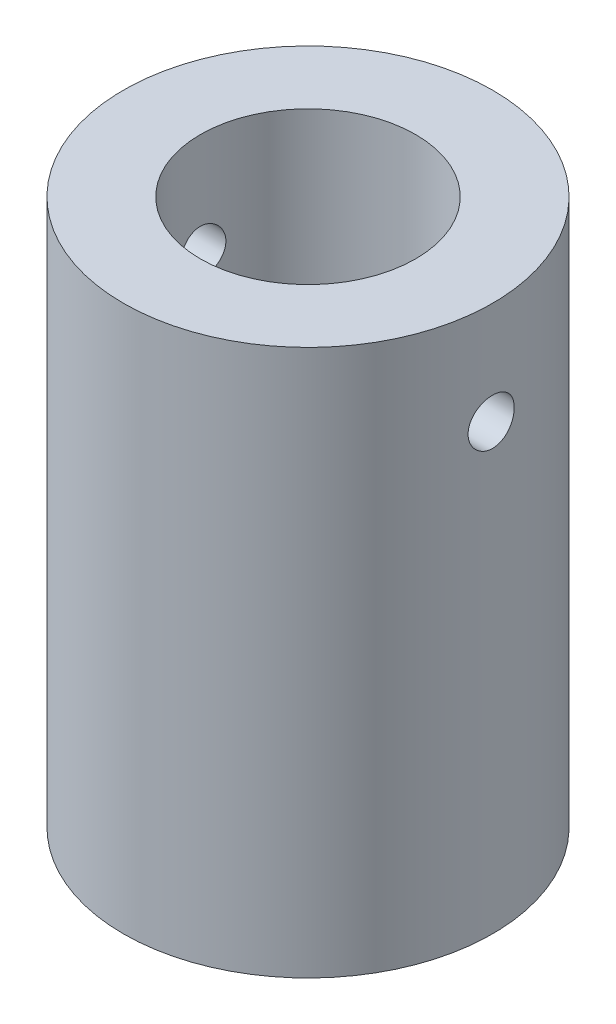
ISO-10303-21;
HEADER;
FILE_DESCRIPTION(('STEP AP214'),'2;1');
FILE_NAME('part.step','',(''),(''),'','','');
FILE_SCHEMA(('AUTOMOTIVE_DESIGN { 1 0 10303 214 1 1 1 1 }'));
ENDSEC;
DATA;
#1=APPLICATION_CONTEXT('core data for automotive mechanical design processes');
#2=APPLICATION_PROTOCOL_DEFINITION('international standard','automotive_design',2000,#1);
#3=PRODUCT_CONTEXT('',#1,'mechanical');
#4=PRODUCT('Part','Part','',(#3));
#5=PRODUCT_RELATED_PRODUCT_CATEGORY('part','',(#4));
#6=PRODUCT_DEFINITION_FORMATION('','',#4);
#7=PRODUCT_DEFINITION_CONTEXT('part definition',#1,'design');
#8=PRODUCT_DEFINITION('design','',#6,#7);
#9=PRODUCT_DEFINITION_SHAPE('','',#8);
#10=(LENGTH_UNIT() NAMED_UNIT(*) SI_UNIT(.MILLI.,.METRE.));
#11=(NAMED_UNIT(*) PLANE_ANGLE_UNIT() SI_UNIT($,.RADIAN.));
#12=(NAMED_UNIT(*) SI_UNIT($,.STERADIAN.) SOLID_ANGLE_UNIT());
#13=UNCERTAINTY_MEASURE_WITH_UNIT(LENGTH_MEASURE(1.E-05),#10,'distance_accuracy_value','');
#14=(GEOMETRIC_REPRESENTATION_CONTEXT(3) GLOBAL_UNCERTAINTY_ASSIGNED_CONTEXT((#13)) GLOBAL_UNIT_ASSIGNED_CONTEXT((#10,
#11,#12)) REPRESENTATION_CONTEXT('',''));
#15=CARTESIAN_POINT('',(0.,0.,0.));
#16=DIRECTION('',(0.,0.,1.));
#17=DIRECTION('',(1.,0.,0.));
#18=AXIS2_PLACEMENT_3D('',#15,#16,#17);
#19=CARTESIAN_POINT('',(0.,0.,0.));
#20=DIRECTION('',(0.,1.,0.));
#21=DIRECTION('',(0.,0.,1.));
#22=AXIS2_PLACEMENT_3D('',#19,#20,#21);
#23=PLANE('',#22);
#24=CARTESIAN_POINT('',(0.,0.,0.));
#25=DIRECTION('',(0.,1.,0.));
#26=DIRECTION('',(0.,0.,1.));
#27=AXIS2_PLACEMENT_3D('',#24,#25,#26);
#28=CIRCLE('',#27,12.);
#29=CARTESIAN_POINT('',(0.,0.,12.));
#30=VERTEX_POINT('',#29);
#31=EDGE_CURVE('E11',#30,#30,#28,.T.);
#32=ORIENTED_EDGE('',*,*,#31,.F.);
#33=EDGE_LOOP('',(#32));
#34=FACE_BOUND('',#33,.T.);
#35=CARTESIAN_POINT('',(0.,0.,0.));
#36=DIRECTION('',(0.,1.,0.));
#37=DIRECTION('',(0.,0.,1.));
#38=AXIS2_PLACEMENT_3D('',#35,#36,#37);
#39=CIRCLE('',#38,8.);
#40=CARTESIAN_POINT('',(0.,0.,8.));
#41=VERTEX_POINT('',#40);
#42=EDGE_CURVE('E46',#41,#41,#39,.T.);
#43=ORIENTED_EDGE('',*,*,#42,.T.);
#44=EDGE_LOOP('',(#43));
#45=FACE_BOUND('',#44,.T.);
#46=ADVANCED_FACE('F32',(#34,#45),#23,.F.);
#47=CARTESIAN_POINT('',(0.,7.5,0.));
#48=DIRECTION('',(0.,-1.,0.));
#49=DIRECTION('',(0.,0.,-1.));
#50=AXIS2_PLACEMENT_3D('',#47,#48,#49);
#51=CYLINDRICAL_SURFACE('',#50,12.);
#52=CARTESIAN_POINT('',(-11.9058808997907,28.8314033224784,-1.5));
#53=CARTESIAN_POINT('',(-11.905882105028,28.9153050927535,-1.49999643290037));
#54=CARTESIAN_POINT('',(-11.9067773707137,28.9992593014213,-1.49293673941278));
#55=CARTESIAN_POINT('',(-11.9102603458798,29.1648312577212,-1.46488584823281));
#56=CARTESIAN_POINT('',(-11.9128498238578,29.2464464707766,-1.44388009265478));
#57=CARTESIAN_POINT('',(-11.9194234426526,29.404919251748,-1.38856601569558));
#58=CARTESIAN_POINT('',(-11.9234066367219,29.4817800077496,-1.35426672287895));
#59=CARTESIAN_POINT('',(-11.9323177411194,29.6286403935723,-1.27335851905772));
#60=CARTESIAN_POINT('',(-11.9372454899057,29.6986411935243,-1.22675171242488));
#61=CARTESIAN_POINT('',(-11.9475213554634,29.8302006707517,-1.12227207015865));
#62=CARTESIAN_POINT('',(-11.9528714502123,29.8917154038698,-1.06434408901458));
#63=CARTESIAN_POINT('',(-11.963371397255,30.0041769838419,-0.938985156402742));
#64=CARTESIAN_POINT('',(-11.9685212395763,30.0551233049352,-0.871553732434825));
#65=CARTESIAN_POINT('',(-11.9780606676769,30.1451594701822,-0.728825898405587));
#66=CARTESIAN_POINT('',(-11.9824476830808,30.1842095495382,-0.653504217336673));
#67=CARTESIAN_POINT('',(-11.9899454217272,30.249090042443,-0.497308030833553));
#68=CARTESIAN_POINT('',(-11.9930561923378,30.2749209466343,-0.416433731616546));
#69=CARTESIAN_POINT('',(-11.9976370122374,30.3124985634791,-0.251877412650669));
#70=CARTESIAN_POINT('',(-11.9991155690156,30.3243183295928,-0.168212315798029));
#71=CARTESIAN_POINT('',(-12.0002944183753,30.3337645535003,-7.39204119310356E-05));
#72=CARTESIAN_POINT('',(-11.9999947809125,30.3313915696499,0.0843993461968594));
#73=CARTESIAN_POINT('',(-11.9976578866201,30.312578200824,0.251259161384725));
#74=CARTESIAN_POINT('',(-11.9956303347344,30.2962163833896,0.333654723458668));
#75=CARTESIAN_POINT('',(-11.990076335654,30.2500126165005,0.494521298343222));
#76=CARTESIAN_POINT('',(-11.9865498599643,30.2201704107783,0.57299223651372));
#77=CARTESIAN_POINT('',(-11.9783775468475,30.1477694268082,0.72402528926318));
#78=CARTESIAN_POINT('',(-11.9737287230594,30.1051766478403,0.796570936704308));
#79=CARTESIAN_POINT('',(-11.9638318143917,30.0085083051488,0.933514471383882));
#80=CARTESIAN_POINT('',(-11.9585837020336,29.9544322147973,0.997911984730411));
#81=CARTESIAN_POINT('',(-11.9480332051411,29.8358922313194,1.11719281846376));
#82=CARTESIAN_POINT('',(-11.9427306948284,29.7713598667504,1.17200810399759));
#83=CARTESIAN_POINT('',(-11.9327044316435,29.633974388409,1.27003971037506));
#84=CARTESIAN_POINT('',(-11.9279806805855,29.5611212485556,1.31325599486105));
#85=CARTESIAN_POINT('',(-11.9196468156763,29.409101625141,1.38686674414964));
#86=CARTESIAN_POINT('',(-11.9160371754488,29.3299324745065,1.41725575791739));
#87=CARTESIAN_POINT('',(-11.9103494549757,29.1675596503623,1.46428899268085));
#88=CARTESIAN_POINT('',(-11.9082713009202,29.0843561714932,1.48093387607977));
#89=CARTESIAN_POINT('',(-11.9058953327043,28.9168774132786,1.49991625914516));
#90=CARTESIAN_POINT('',(-11.9055856046543,28.8326131486251,1.50234950519897));
#91=CARTESIAN_POINT('',(-11.9067500467179,28.6648781646792,1.49309217193833));
#92=CARTESIAN_POINT('',(-11.9082241788087,28.5814074285108,1.48140189366588));
#93=CARTESIAN_POINT('',(-11.9127793709039,28.4179158643317,1.44430997147863));
#94=CARTESIAN_POINT('',(-11.915854996168,28.3378843533642,1.41895469024763));
#95=CARTESIAN_POINT('',(-11.9232622198248,28.1832088295665,1.35530023146967));
#96=CARTESIAN_POINT('',(-11.9275938623446,28.1085650061339,1.31700059914873));
#97=CARTESIAN_POINT('',(-11.9370535881194,27.9663505361906,1.22830921329295));
#98=CARTESIAN_POINT('',(-11.9421857564225,27.8988193232898,1.17785467174626));
#99=CARTESIAN_POINT('',(-11.9526554373061,27.7731493901174,1.06637444542137));
#100=CARTESIAN_POINT('',(-11.9579929578677,27.7150110353576,1.00534834945529));
#101=CARTESIAN_POINT('',(-11.9683085321218,27.6094408100778,0.87403906533511));
#102=CARTESIAN_POINT('',(-11.9732843634751,27.5620718544014,0.803705095270216));
#103=CARTESIAN_POINT('',(-11.9822826781897,27.4798203918981,0.656023549009069));
#104=CARTESIAN_POINT('',(-11.9863051807663,27.4449376333898,0.57867611422099));
#105=CARTESIAN_POINT('',(-11.9929337439191,27.3887526503336,0.41937231548367));
#106=CARTESIAN_POINT('',(-11.9955435941262,27.3674140648594,0.337428939907064));
#107=CARTESIAN_POINT('',(-11.9990685280654,27.3388048689424,0.171087634366773));
#108=CARTESIAN_POINT('',(-11.9999836882211,27.3315336241189,0.0866898152628617));
#109=CARTESIAN_POINT('',(-12.000015768082,27.3312773691031,-0.0815503100062735));
#110=CARTESIAN_POINT('',(-11.999144899007,27.3381953461376,-0.165392482628844));
#111=CARTESIAN_POINT('',(-11.9957270469476,27.3659156905369,-0.330712644871572));
#112=CARTESIAN_POINT('',(-11.9931800651289,27.3867180482455,-0.412190636135913));
#113=CARTESIAN_POINT('',(-11.9866949112722,27.4415861910882,-0.570456865792393));
#114=CARTESIAN_POINT('',(-11.9827572266068,27.4756473301024,-0.647246736095748));
#115=CARTESIAN_POINT('',(-11.9739266856377,27.556056111243,-0.79403600228642));
#116=CARTESIAN_POINT('',(-11.9690338179787,27.6024038994354,-0.864035317432822));
#117=CARTESIAN_POINT('',(-11.9587991635535,27.7064292516803,-0.995752060777539));
#118=CARTESIAN_POINT('',(-11.9534546476735,27.7641789985926,-1.05741227270059));
#119=CARTESIAN_POINT('',(-11.9429409540812,27.8892190888957,-1.17020467129161));
#120=CARTESIAN_POINT('',(-11.937771818202,27.956511688973,-1.2213343606761));
#121=CARTESIAN_POINT('',(-11.9281728683681,28.0990252760968,-1.31178314550962));
#122=CARTESIAN_POINT('',(-11.9237459865137,28.1742758764395,-1.35105586990004));
#123=CARTESIAN_POINT('',(-11.9161671487177,28.3303173668353,-1.41635117300602));
#124=CARTESIAN_POINT('',(-11.9130138069233,28.4111021220605,-1.44238816273699));
#125=CARTESIAN_POINT('',(-11.9091047209191,28.5488213147045,-1.47423953774279));
#126=CARTESIAN_POINT('',(-11.9079018091315,28.604887093401,-1.48388581860635));
#127=CARTESIAN_POINT('',(-11.9062894933795,28.7177616724586,-1.49676723354331));
#128=CARTESIAN_POINT('',(-11.9058800833946,28.774570467179,-1.5000024162596));
#129=CARTESIAN_POINT('',(-11.9058808997907,28.8314033224784,-1.5));
#130=B_SPLINE_CURVE_WITH_KNOTS('',3,(#52,#53,#54,#55,#56,#57,#58,#59,#60,#61,#62,#63,#64,#65,
#66,#67,#68,#69,#70,#71,#72,#73,#74,#75,#76,#77,#78,#79,#80,#81,#82,#83,#84,#85,#86,#87,#88,#89,
#90,#91,#92,#93,#94,#95,#96,#97,#98,#99,#100,#101,#102,#103,#104,#105,#106,#107,#108,#109,#110,
#111,#112,#113,#114,#115,#116,#117,#118,#119,#120,#121,#122,#123,#124,#125,#126,#127,#128,#129),
.UNSPECIFIED.,.T.,.F.,(4,2,2,2,2,2,2,2,2,2,2,2,2,2,2,2,2,2,2,2,2,2,2,2,2,2,2,2,2,2,2,2,2,2,2,2,
2,2,4),(0.,0.251497690487545,0.503258325691428,0.75484827154872,1.00639522770368,
1.2591994652944,1.51201627645547,1.76566911687445,2.01931254203898,2.27162758164875,
2.52393269502065,2.77482998959823,3.02573205403074,3.27730922647682,3.52889793881463,
3.78220618426662,4.03551522371655,4.28893180043405,4.54233616293713,4.7940313068353,
5.04572108596269,5.2965622577564,5.54741224327112,5.79958691726467,6.05177140196887,
6.30539331535406,6.55901011625327,6.81194314070965,7.06486475863687,7.31606289772953,
7.56726086212073,7.81837088126455,8.06948388578549,8.32224077334502,8.57505753263898,
8.82885058622901,9.0823667158921,9.2527259377977,9.42308386713285),.UNSPECIFIED.);
#131=CARTESIAN_POINT('',(-11.9058808997907,28.8314033224784,-1.5));
#132=VERTEX_POINT('',#131);
#133=EDGE_CURVE('E149',#132,#132,#130,.T.);
#134=ORIENTED_EDGE('',*,*,#133,.T.);
#135=EDGE_LOOP('',(#134));
#136=FACE_BOUND('',#135,.T.);
#137=CARTESIAN_POINT('',(11.9058808997907,28.8314033224784,-1.5));
#138=CARTESIAN_POINT('',(11.905882105028,28.7475015522033,-1.49999643290037));
#139=CARTESIAN_POINT('',(11.9067773707137,28.6635473435355,-1.49293673941278));
#140=CARTESIAN_POINT('',(11.9102603458798,28.4979753872357,-1.46488584823281));
#141=CARTESIAN_POINT('',(11.9128498238578,28.4163601741802,-1.44388009265478));
#142=CARTESIAN_POINT('',(11.9194234426526,28.2578873932088,-1.38856601569558));
#143=CARTESIAN_POINT('',(11.9234066367219,28.1810266372072,-1.35426672287895));
#144=CARTESIAN_POINT('',(11.9323177411194,28.0341662513846,-1.27335851905772));
#145=CARTESIAN_POINT('',(11.9372454899057,27.9641654514326,-1.22675171242488));
#146=CARTESIAN_POINT('',(11.9475213554634,27.8326059742051,-1.12227207015865));
#147=CARTESIAN_POINT('',(11.9528714502123,27.7710912410871,-1.06434408901458));
#148=CARTESIAN_POINT('',(11.963371397255,27.658629661115,-0.938985156402742));
#149=CARTESIAN_POINT('',(11.9685212395763,27.6076833400216,-0.871553732434825));
#150=CARTESIAN_POINT('',(11.9780606676769,27.5176471747746,-0.728825898405588));
#151=CARTESIAN_POINT('',(11.9824476830808,27.4785970954186,-0.653504217336674));
#152=CARTESIAN_POINT('',(11.9899454217272,27.4137166025138,-0.497308030833556));
#153=CARTESIAN_POINT('',(11.9930561923378,27.3878856983225,-0.41643373161655));
#154=CARTESIAN_POINT('',(11.9976370122374,27.3503080814778,-0.251877412650675));
#155=CARTESIAN_POINT('',(11.9991155690156,27.3384883153641,-0.168212315798034));
#156=CARTESIAN_POINT('',(12.0002944183753,27.3290420914565,-7.39204119337868E-05));
#157=CARTESIAN_POINT('',(11.9999947809125,27.3314150753069,0.0843993461968572));
#158=CARTESIAN_POINT('',(11.9976578866201,27.3502284441329,0.251259161384724));
#159=CARTESIAN_POINT('',(11.9956303347344,27.3665902615672,0.333654723458667));
#160=CARTESIAN_POINT('',(11.990076335654,27.4127940284564,0.494521298343222));
#161=CARTESIAN_POINT('',(11.9865498599643,27.4426362341785,0.57299223651372));
#162=CARTESIAN_POINT('',(11.9783775468475,27.5150372181487,0.72402528926318));
#163=CARTESIAN_POINT('',(11.9737287230594,27.5576299971165,0.796570936704309));
#164=CARTESIAN_POINT('',(11.9638318143917,27.654298339808,0.933514471383883));
#165=CARTESIAN_POINT('',(11.9585837020336,27.7083744301596,0.997911984730412));
#166=CARTESIAN_POINT('',(11.9480332051411,27.8269144136374,1.11719281846376));
#167=CARTESIAN_POINT('',(11.9427306948284,27.8914467782064,1.17200810399759));
#168=CARTESIAN_POINT('',(11.9327044316435,28.0288322565479,1.27003971037506));
#169=CARTESIAN_POINT('',(11.9279806805855,28.1016853964013,1.31325599486105));
#170=CARTESIAN_POINT('',(11.9196468156763,28.2537050198158,1.38686674414964));
#171=CARTESIAN_POINT('',(11.9160371754488,28.3328741704503,1.41725575791739));
#172=CARTESIAN_POINT('',(11.9103494549757,28.4952469945945,1.46428899268085));
#173=CARTESIAN_POINT('',(11.9082713009202,28.5784504734637,1.48093387607977));
#174=CARTESIAN_POINT('',(11.9058953327043,28.7459292316783,1.49991625914516));
#175=CARTESIAN_POINT('',(11.9055856046543,28.8301934963317,1.50234950519897));
#176=CARTESIAN_POINT('',(11.9067500467179,28.9979284802777,1.49309217193833));
#177=CARTESIAN_POINT('',(11.9082241788087,29.081399216446,1.48140189366588));
#178=CARTESIAN_POINT('',(11.9127793709039,29.2448907806251,1.44430997147863));
#179=CARTESIAN_POINT('',(11.915854996168,29.3249222915927,1.41895469024763));
#180=CARTESIAN_POINT('',(11.9232622198248,29.4795978153903,1.35530023146967));
#181=CARTESIAN_POINT('',(11.9275938623446,29.5542416388229,1.31700059914873));
#182=CARTESIAN_POINT('',(11.9370535881194,29.6964561087662,1.22830921329295));
#183=CARTESIAN_POINT('',(11.9421857564225,29.7639873216671,1.17785467174626));
#184=CARTESIAN_POINT('',(11.9526554373061,29.8896572548394,1.06637444542137));
#185=CARTESIAN_POINT('',(11.9579929578677,29.9477956095992,1.00534834945529));
#186=CARTESIAN_POINT('',(11.9683085321218,30.0533658348791,0.874039065335112));
#187=CARTESIAN_POINT('',(11.9732843634751,30.1007347905554,0.803705095270218));
#188=CARTESIAN_POINT('',(11.9822826781897,30.1829862530587,0.656023549009072));
#189=CARTESIAN_POINT('',(11.9863051807663,30.217869011567,0.578676114220991));
#190=CARTESIAN_POINT('',(11.9929337439191,30.2740539946232,0.419372315483671));
#191=CARTESIAN_POINT('',(11.9955435941262,30.2953925800974,0.337428939907066));
#192=CARTESIAN_POINT('',(11.9990685280654,30.3240017760145,0.171087634366775));
#193=CARTESIAN_POINT('',(11.9999836882211,30.331273020838,0.086689815262863));
#194=CARTESIAN_POINT('',(12.000015768082,30.3315292758537,-0.0815503100062721));
#195=CARTESIAN_POINT('',(11.999144899007,30.3246112988192,-0.165392482628843));
#196=CARTESIAN_POINT('',(11.9957270469476,30.2968909544199,-0.33071264487157));
#197=CARTESIAN_POINT('',(11.9931800651289,30.2760885967114,-0.412190636135912));
#198=CARTESIAN_POINT('',(11.9866949112722,30.2212204538686,-0.570456865792393));
#199=CARTESIAN_POINT('',(11.9827572266068,30.1871593148545,-0.647246736095748));
#200=CARTESIAN_POINT('',(11.9739266856377,30.1067505337139,-0.79403600228642));
#201=CARTESIAN_POINT('',(11.9690338179787,30.0604027455214,-0.864035317432822));
#202=CARTESIAN_POINT('',(11.9587991635535,29.9563773932766,-0.995752060777539));
#203=CARTESIAN_POINT('',(11.9534546476735,29.8986276463642,-1.05741227270059));
#204=CARTESIAN_POINT('',(11.9429409540812,29.7735875560611,-1.17020467129161));
#205=CARTESIAN_POINT('',(11.937771818202,29.7062949559839,-1.2213343606761));
#206=CARTESIAN_POINT('',(11.9281728683681,29.56378136886,-1.31178314550962));
#207=CARTESIAN_POINT('',(11.9237459865137,29.4885307685174,-1.35105586990005));
#208=CARTESIAN_POINT('',(11.9161671487177,29.3324892781216,-1.41635117300602));
#209=CARTESIAN_POINT('',(11.9130138069233,29.2517045228964,-1.44238816273699));
#210=CARTESIAN_POINT('',(11.9091047209191,29.1139853302523,-1.47423953774279));
#211=CARTESIAN_POINT('',(11.9079018091315,29.0579195515559,-1.48388581860635));
#212=CARTESIAN_POINT('',(11.9062894933795,28.9450449724983,-1.49676723354331));
#213=CARTESIAN_POINT('',(11.9058800833946,28.8882361777778,-1.5000024162596));
#214=CARTESIAN_POINT('',(11.9058808997907,28.8314033224784,-1.5));
#215=B_SPLINE_CURVE_WITH_KNOTS('',3,(#137,#138,#139,#140,#141,#142,#143,#144,#145,#146,#147,
#148,#149,#150,#151,#152,#153,#154,#155,#156,#157,#158,#159,#160,#161,#162,#163,#164,#165,#166,
#167,#168,#169,#170,#171,#172,#173,#174,#175,#176,#177,#178,#179,#180,#181,#182,#183,#184,#185,
#186,#187,#188,#189,#190,#191,#192,#193,#194,#195,#196,#197,#198,#199,#200,#201,#202,#203,#204,
#205,#206,#207,#208,#209,#210,#211,#212,#213,#214),.UNSPECIFIED.,.T.,.F.,(4,2,2,2,2,2,2,2,2,2,2,
2,2,2,2,2,2,2,2,2,2,2,2,2,2,2,2,2,2,2,2,2,2,2,2,2,2,2,4),(0.,0.251497690487542,
0.503258325691428,0.75484827154872,1.00639522770368,1.2591994652944,1.51201627645547,
1.76566911687444,2.01931254203898,2.27162758164874,2.52393269502065,2.77482998959823,
3.02573205403074,3.27730922647683,3.52889793881463,3.78220618426662,4.03551522371655,
4.28893180043406,4.54233616293713,4.7940313068353,5.04572108596269,5.2965622577564,
5.54741224327112,5.79958691726467,6.05177140196887,6.30539331535406,6.55901011625327,
6.81194314070965,7.06486475863687,7.31606289772953,7.56726086212073,7.81837088126454,
8.06948388578549,8.32224077334502,8.57505753263898,8.82885058622901,9.0823667158921,
9.2527259377977,9.42308386713285),.UNSPECIFIED.);
#216=CARTESIAN_POINT('',(11.9058808997907,28.8314033224784,-1.5));
#217=VERTEX_POINT('',#216);
#218=EDGE_CURVE('E145',#217,#217,#215,.T.);
#219=ORIENTED_EDGE('',*,*,#218,.T.);
#220=EDGE_LOOP('',(#219));
#221=FACE_BOUND('',#220,.T.);
#222=ORIENTED_EDGE('',*,*,#31,.T.);
#223=EDGE_LOOP('',(#222));
#224=FACE_BOUND('',#223,.T.);
#225=CARTESIAN_POINT('',(0.,35.5,0.));
#226=DIRECTION('',(0.,1.,0.));
#227=DIRECTION('',(0.,0.,1.));
#228=AXIS2_PLACEMENT_3D('',#225,#226,#227);
#229=CIRCLE('',#228,12.);
#230=CARTESIAN_POINT('',(0.,35.5,12.));
#231=VERTEX_POINT('',#230);
#232=EDGE_CURVE('E117',#231,#231,#229,.T.);
#233=ORIENTED_EDGE('',*,*,#232,.F.);
#234=EDGE_LOOP('',(#233));
#235=FACE_BOUND('',#234,.T.);
#236=ADVANCED_FACE('F34',(#136,#221,#224,#235),#51,.T.);
#237=CARTESIAN_POINT('',(0.,7.5,0.));
#238=DIRECTION('',(0.,-1.,0.));
#239=DIRECTION('',(0.,0.,-1.));
#240=AXIS2_PLACEMENT_3D('',#237,#238,#239);
#241=CYLINDRICAL_SURFACE('',#240,8.);
#242=CARTESIAN_POINT('',(0.,7.5,0.));
#243=DIRECTION('',(0.,1.,0.));
#244=DIRECTION('',(0.,0.,1.));
#245=AXIS2_PLACEMENT_3D('',#242,#243,#244);
#246=CIRCLE('',#245,8.);
#247=CARTESIAN_POINT('',(0.,7.5,8.));
#248=VERTEX_POINT('',#247);
#249=EDGE_CURVE('E122',#248,#248,#246,.T.);
#250=ORIENTED_EDGE('',*,*,#249,.T.);
#251=EDGE_LOOP('',(#250));
#252=FACE_BOUND('',#251,.T.);
#253=ORIENTED_EDGE('',*,*,#42,.F.);
#254=EDGE_LOOP('',(#253));
#255=FACE_BOUND('',#254,.T.);
#256=ADVANCED_FACE('F169',(#252,#255),#241,.F.);
#257=CARTESIAN_POINT('',(0.,7.5,0.));
#258=DIRECTION('',(0.,1.,0.));
#259=DIRECTION('',(0.,0.,1.));
#260=AXIS2_PLACEMENT_3D('',#257,#258,#259);
#261=PLANE('',#260);
#262=DIRECTION('',(-0.900062962235813,0.,0.435759869665958));
#263=VECTOR('',#262,1.);
#264=CARTESIAN_POINT('',(4.6753799116562,7.5,1.62506082399449));
#265=LINE('',#264,#263);
#266=CARTESIAN_POINT('',(4.6753799116562,7.5,1.62506082399449));
#267=VERTEX_POINT('',#266);
#268=CARTESIAN_POINT('',(-1.62506082399449,7.5,4.6753799116562));
#269=VERTEX_POINT('',#268);
#270=EDGE_CURVE('E89',#267,#269,#265,.T.);
#271=ORIENTED_EDGE('',*,*,#270,.F.);
#272=DIRECTION('',(0.435759869665958,0.,0.900062962235813));
#273=VECTOR('',#272,1.);
#274=CARTESIAN_POINT('',(1.6250608239945,7.5,-4.6753799116562));
#275=LINE('',#274,#273);
#276=CARTESIAN_POINT('',(1.6250608239945,7.5,-4.6753799116562));
#277=VERTEX_POINT('',#276);
#278=EDGE_CURVE('E54',#277,#267,#275,.T.);
#279=ORIENTED_EDGE('',*,*,#278,.F.);
#280=DIRECTION('',(0.900062962235814,0.,-0.435759869665958));
#281=VECTOR('',#280,1.);
#282=CARTESIAN_POINT('',(-4.6753799116562,7.5,-1.62506082399449));
#283=LINE('',#282,#281);
#284=CARTESIAN_POINT('',(-4.6753799116562,7.5,-1.62506082399449));
#285=VERTEX_POINT('',#284);
#286=EDGE_CURVE('E105',#285,#277,#283,.T.);
#287=ORIENTED_EDGE('',*,*,#286,.F.);
#288=DIRECTION('',(-0.435759869665958,0.,-0.900062962235814));
#289=VECTOR('',#288,1.);
#290=CARTESIAN_POINT('',(-1.62506082399449,7.5,4.6753799116562));
#291=LINE('',#290,#289);
#292=EDGE_CURVE('E113',#269,#285,#291,.T.);
#293=ORIENTED_EDGE('',*,*,#292,.F.);
#294=EDGE_LOOP('',(#271,#279,#287,#293));
#295=FACE_BOUND('',#294,.T.);
#296=ORIENTED_EDGE('',*,*,#249,.F.);
#297=EDGE_LOOP('',(#296));
#298=FACE_BOUND('',#297,.T.);
#299=ADVANCED_FACE('F164',(#295,#298),#261,.F.);
#300=CARTESIAN_POINT('',(0.,35.5,0.));
#301=DIRECTION('',(0.,1.,0.));
#302=DIRECTION('',(0.,0.,1.));
#303=AXIS2_PLACEMENT_3D('',#300,#301,#302);
#304=PLANE('',#303);
#305=CARTESIAN_POINT('',(0.,35.5,0.));
#306=DIRECTION('',(0.,1.,0.));
#307=DIRECTION('',(0.,0.,1.));
#308=AXIS2_PLACEMENT_3D('',#305,#306,#307);
#309=CIRCLE('',#308,7.);
#310=CARTESIAN_POINT('',(0.,35.5,7.));
#311=VERTEX_POINT('',#310);
#312=EDGE_CURVE('E154',#311,#311,#309,.T.);
#313=ORIENTED_EDGE('',*,*,#312,.F.);
#314=EDGE_LOOP('',(#313));
#315=FACE_BOUND('',#314,.T.);
#316=ORIENTED_EDGE('',*,*,#232,.T.);
#317=EDGE_LOOP('',(#316));
#318=FACE_BOUND('',#317,.T.);
#319=ADVANCED_FACE('F160',(#315,#318),#304,.T.);
#320=CARTESIAN_POINT('',(1.6250608239945,18.5,-4.6753799116562));
#321=DIRECTION('',(0.900062962235813,0.,-0.435759869665958));
#322=DIRECTION('',(-0.435759869665958,0.,-0.900062962235813));
#323=AXIS2_PLACEMENT_3D('',#320,#321,#322);
#324=PLANE('',#323);
#325=ORIENTED_EDGE('',*,*,#278,.T.);
#326=DIRECTION('',(0.,-1.,0.));
#327=VECTOR('',#326,1.);
#328=CARTESIAN_POINT('',(4.6753799116562,18.5,1.62506082399449));
#329=LINE('',#328,#327);
#330=CARTESIAN_POINT('',(4.6753799116562,18.5,1.62506082399449));
#331=VERTEX_POINT('',#330);
#332=EDGE_CURVE('E77',#331,#267,#329,.T.);
#333=ORIENTED_EDGE('',*,*,#332,.F.);
#334=DIRECTION('',(0.435759869665958,0.,0.900062962235813));
#335=VECTOR('',#334,1.);
#336=CARTESIAN_POINT('',(1.6250608239945,18.5,-4.6753799116562));
#337=LINE('',#336,#335);
#338=CARTESIAN_POINT('',(1.6250608239945,18.5,-4.6753799116562));
#339=VERTEX_POINT('',#338);
#340=EDGE_CURVE('E103',#339,#331,#337,.T.);
#341=ORIENTED_EDGE('',*,*,#340,.F.);
#342=DIRECTION('',(0.,-1.,0.));
#343=VECTOR('',#342,1.);
#344=CARTESIAN_POINT('',(1.6250608239945,18.5,-4.6753799116562));
#345=LINE('',#344,#343);
#346=EDGE_CURVE('E62',#339,#277,#345,.T.);
#347=ORIENTED_EDGE('',*,*,#346,.T.);
#348=EDGE_LOOP('',(#325,#333,#341,#347));
#349=FACE_BOUND('',#348,.T.);
#350=ADVANCED_FACE('F163',(#349),#324,.F.);
#351=CARTESIAN_POINT('',(-4.6753799116562,18.5,-1.62506082399449));
#352=DIRECTION('',(-0.435759869665958,0.,-0.900062962235814));
#353=DIRECTION('',(-0.900062962235814,0.,0.435759869665958));
#354=AXIS2_PLACEMENT_3D('',#351,#352,#353);
#355=PLANE('',#354);
#356=ORIENTED_EDGE('',*,*,#286,.T.);
#357=ORIENTED_EDGE('',*,*,#346,.F.);
#358=DIRECTION('',(0.900062962235814,0.,-0.435759869665958));
#359=VECTOR('',#358,1.);
#360=CARTESIAN_POINT('',(-4.6753799116562,18.5,-1.62506082399449));
#361=LINE('',#360,#359);
#362=CARTESIAN_POINT('',(-4.6753799116562,18.5,-1.62506082399449));
#363=VERTEX_POINT('',#362);
#364=EDGE_CURVE('E100',#363,#339,#361,.T.);
#365=ORIENTED_EDGE('',*,*,#364,.F.);
#366=DIRECTION('',(0.,-1.,0.));
#367=VECTOR('',#366,1.);
#368=CARTESIAN_POINT('',(-4.6753799116562,18.5,-1.62506082399449));
#369=LINE('',#368,#367);
#370=EDGE_CURVE('E93',#363,#285,#369,.T.);
#371=ORIENTED_EDGE('',*,*,#370,.T.);
#372=EDGE_LOOP('',(#356,#357,#365,#371));
#373=FACE_BOUND('',#372,.T.);
#374=ADVANCED_FACE('F210',(#373),#355,.F.);
#375=CARTESIAN_POINT('',(-1.62506082399449,18.5,4.6753799116562));
#376=DIRECTION('',(-0.900062962235814,0.,0.435759869665958));
#377=DIRECTION('',(0.435759869665958,0.,0.900062962235814));
#378=AXIS2_PLACEMENT_3D('',#375,#376,#377);
#379=PLANE('',#378);
#380=ORIENTED_EDGE('',*,*,#292,.T.);
#381=ORIENTED_EDGE('',*,*,#370,.F.);
#382=DIRECTION('',(-0.435759869665958,0.,-0.900062962235814));
#383=VECTOR('',#382,1.);
#384=CARTESIAN_POINT('',(-1.62506082399449,18.5,4.6753799116562));
#385=LINE('',#384,#383);
#386=CARTESIAN_POINT('',(-1.62506082399449,18.5,4.6753799116562));
#387=VERTEX_POINT('',#386);
#388=EDGE_CURVE('E96',#387,#363,#385,.T.);
#389=ORIENTED_EDGE('',*,*,#388,.F.);
#390=DIRECTION('',(0.,-1.,0.));
#391=VECTOR('',#390,1.);
#392=CARTESIAN_POINT('',(-1.62506082399449,18.5,4.6753799116562));
#393=LINE('',#392,#391);
#394=EDGE_CURVE('E82',#387,#269,#393,.T.);
#395=ORIENTED_EDGE('',*,*,#394,.T.);
#396=EDGE_LOOP('',(#380,#381,#389,#395));
#397=FACE_BOUND('',#396,.T.);
#398=ADVANCED_FACE('F97',(#397),#379,.F.);
#399=CARTESIAN_POINT('',(4.6753799116562,18.5,1.62506082399449));
#400=DIRECTION('',(0.435759869665958,0.,0.900062962235814));
#401=DIRECTION('',(0.900062962235814,0.,-0.435759869665958));
#402=AXIS2_PLACEMENT_3D('',#399,#400,#401);
#403=PLANE('',#402);
#404=ORIENTED_EDGE('',*,*,#270,.T.);
#405=ORIENTED_EDGE('',*,*,#394,.F.);
#406=DIRECTION('',(-0.900062962235813,0.,0.435759869665958));
#407=VECTOR('',#406,1.);
#408=CARTESIAN_POINT('',(4.6753799116562,18.5,1.62506082399449));
#409=LINE('',#408,#407);
#410=EDGE_CURVE('E86',#331,#387,#409,.T.);
#411=ORIENTED_EDGE('',*,*,#410,.F.);
#412=ORIENTED_EDGE('',*,*,#332,.T.);
#413=EDGE_LOOP('',(#404,#405,#411,#412));
#414=FACE_BOUND('',#413,.T.);
#415=ADVANCED_FACE('F84',(#414),#403,.F.);
#416=CARTESIAN_POINT('',(4.6753799116562,18.5,1.62506082399449));
#417=DIRECTION('',(0.,-1.,0.));
#418=DIRECTION('',(0.,0.,-1.));
#419=AXIS2_PLACEMENT_3D('',#416,#417,#418);
#420=PLANE('',#419);
#421=ORIENTED_EDGE('',*,*,#340,.T.);
#422=ORIENTED_EDGE('',*,*,#410,.T.);
#423=ORIENTED_EDGE('',*,*,#388,.T.);
#424=ORIENTED_EDGE('',*,*,#364,.T.);
#425=EDGE_LOOP('',(#421,#422,#423,#424));
#426=FACE_BOUND('',#425,.T.);
#427=ADVANCED_FACE('F102',(#426),#420,.T.);
#428=CARTESIAN_POINT('',(0.,19.5,0.));
#429=DIRECTION('',(0.,1.,0.));
#430=DIRECTION('',(0.,0.,1.));
#431=AXIS2_PLACEMENT_3D('',#428,#429,#430);
#432=CYLINDRICAL_SURFACE('',#431,7.);
#433=CARTESIAN_POINT('',(-6.83739716558867,28.8314033224784,-1.5));
#434=CARTESIAN_POINT('',(-6.83739884558951,28.7481921699965,-1.49999708238614));
#435=CARTESIAN_POINT('',(-6.83893272341929,28.6649455485363,-1.49305236244768));
#436=CARTESIAN_POINT('',(-6.84489178429867,28.5008166502364,-1.46548559253));
#437=CARTESIAN_POINT('',(-6.84931911211841,28.4199361738022,-1.44485339653622));
#438=CARTESIAN_POINT('',(-6.86054115293409,28.2629375729042,-1.390588636846));
#439=CARTESIAN_POINT('',(-6.86733332725825,28.186814444357,-1.35697000991315));
#440=CARTESIAN_POINT('',(-6.88251670848644,28.0412880485338,-1.27772617673341));
#441=CARTESIAN_POINT('',(-6.89090786877545,27.9718845854493,-1.23210132048776));
#442=CARTESIAN_POINT('',(-6.90849578796654,27.8406403609963,-1.12935142570221));
#443=CARTESIAN_POINT('',(-6.91770249871754,27.7789244462385,-1.07206859483983));
#444=CARTESIAN_POINT('',(-6.93579691710397,27.6658997680726,-0.94796950812958));
#445=CARTESIAN_POINT('',(-6.94468460051416,27.6145917936184,-0.881152530217679));
#446=CARTESIAN_POINT('',(-6.96124769109432,27.523347877987,-0.739047288464585));
#447=CARTESIAN_POINT('',(-6.96890998819429,27.4835316667078,-0.663680488229956));
#448=CARTESIAN_POINT('',(-6.98204671042934,27.4171756310321,-0.507134269342597));
#449=CARTESIAN_POINT('',(-6.98752137103329,27.3906343776921,-0.425955477380314));
#450=CARTESIAN_POINT('',(-6.9955956528118,27.3519733515471,-0.261387187671514));
#451=CARTESIAN_POINT('',(-6.99823733378385,27.339642393926,-0.178049400596926));
#452=CARTESIAN_POINT('',(-7.00049362207002,27.3290920451652,-0.0104489453066476));
#453=CARTESIAN_POINT('',(-7.00010856232698,27.3308711019177,0.073813620164756));
#454=CARTESIAN_POINT('',(-6.99638700862558,27.348332287142,0.239417029250508));
#455=CARTESIAN_POINT('',(-6.99309883152432,27.3637868227683,0.320783115362109));
#456=CARTESIAN_POINT('',(-6.98399541589105,27.4077980043303,0.479739463978385));
#457=CARTESIAN_POINT('',(-6.97818006616518,27.4363552267782,0.55732956017505));
#458=CARTESIAN_POINT('',(-6.96459754646858,27.5059647813669,0.707167497556549));
#459=CARTESIAN_POINT('',(-6.95681685803946,27.5471040896828,0.779373657015785));
#460=CARTESIAN_POINT('',(-6.94015793743865,27.640645290642,0.915940926562842));
#461=CARTESIAN_POINT('',(-6.93127956144693,27.6930486597787,0.980301006451525));
#462=CARTESIAN_POINT('',(-6.91319326460925,27.8088718670063,1.10070208800198));
#463=CARTESIAN_POINT('',(-6.90398230372853,27.8724909018355,1.1565511732025));
#464=CARTESIAN_POINT('',(-6.88643566831974,28.0082866075469,1.25682243234728));
#465=CARTESIAN_POINT('',(-6.87810001563387,28.0804634918837,1.30124432118068));
#466=CARTESIAN_POINT('',(-6.86324023586723,28.2316278235422,1.37748077573296));
#467=CARTESIAN_POINT('',(-6.85672115127775,28.3106334463309,1.40926035088922));
#468=CARTESIAN_POINT('',(-6.84630340806617,28.4730360884249,1.45903495159115));
#469=CARTESIAN_POINT('',(-6.84240435218483,28.5564324399216,1.47703206694627));
#470=CARTESIAN_POINT('',(-6.83774881255446,28.7234990751281,1.49843586024652));
#471=CARTESIAN_POINT('',(-6.83693227051701,28.8071319975557,1.5021214192864));
#472=CARTESIAN_POINT('',(-6.83837239573994,28.9738173156601,1.49555139642373));
#473=CARTESIAN_POINT('',(-6.84062886101063,29.056869749132,1.48529673081635));
#474=CARTESIAN_POINT('',(-6.84790415484206,29.2190737574592,1.45137894635584));
#475=CARTESIAN_POINT('',(-6.85289155274364,29.2982587550754,1.42786830251553));
#476=CARTESIAN_POINT('',(-6.86503859869777,29.4515656600113,1.36827052946749));
#477=CARTESIAN_POINT('',(-6.87219844772849,29.5256870981126,1.33218223662818));
#478=CARTESIAN_POINT('',(-6.88801634080345,29.6679730072373,1.24783504416704));
#479=CARTESIAN_POINT('',(-6.89669501746317,29.7360329044906,1.19940368590792));
#480=CARTESIAN_POINT('',(-6.91451775360139,29.8631616683522,1.091971838336));
#481=CARTESIAN_POINT('',(-6.92366186834461,29.9222294639269,1.03297009182161));
#482=CARTESIAN_POINT('',(-6.94158239990173,30.0307736254232,0.90481276442081));
#483=CARTESIAN_POINT('',(-6.95034935607746,30.0800602386354,0.835494925828766));
#484=CARTESIAN_POINT('',(-6.96635610714901,30.1662887318295,0.68940148128227));
#485=CARTESIAN_POINT('',(-6.97359597176692,30.2032311754513,0.612626216043734));
#486=CARTESIAN_POINT('',(-6.98569278381574,30.2634553771169,0.454265418982036));
#487=CARTESIAN_POINT('',(-6.99056443803698,30.2868216262247,0.372713193075168));
#488=CARTESIAN_POINT('',(-6.9974393930198,30.3194950282107,0.206725177003286));
#489=CARTESIAN_POINT('',(-6.99944309312296,30.3288041384523,0.122289789973989));
#490=CARTESIAN_POINT('',(-7.00034511009057,30.3330139748903,-0.0452637170528327));
#491=CARTESIAN_POINT('',(-6.99930459001667,30.328198481083,-0.128374505509233));
#492=CARTESIAN_POINT('',(-6.99436552363383,30.3049285589594,-0.292572938415963));
#493=CARTESIAN_POINT('',(-6.99046702473686,30.2864743569001,-0.373660616405288));
#494=CARTESIAN_POINT('',(-6.98025388638537,30.2365845162289,-0.531301948487273));
#495=CARTESIAN_POINT('',(-6.97394646430493,30.2051876330929,-0.607868365073181));
#496=CARTESIAN_POINT('',(-6.95959036050661,30.1303420513093,-0.754684956723223));
#497=CARTESIAN_POINT('',(-6.9515415172034,30.0868922341724,-0.824934544796144));
#498=CARTESIAN_POINT('',(-6.93439809934493,29.9882410037357,-0.958512306895245));
#499=CARTESIAN_POINT('',(-6.92528708907874,29.9328391641571,-1.02169036510578));
#500=CARTESIAN_POINT('',(-6.90713690075836,29.8122627122281,-1.13795001457643));
#501=CARTESIAN_POINT('',(-6.89809774045682,29.7470857591228,-1.19102918062422));
#502=CARTESIAN_POINT('',(-6.88098693651915,29.6078128292928,-1.28623261596675));
#503=CARTESIAN_POINT('',(-6.87292905956533,29.5336139641914,-1.32820897809617));
#504=CARTESIAN_POINT('',(-6.85886497228049,29.3790596015552,-1.39903004659825));
#505=CARTESIAN_POINT('',(-6.85285699581573,29.2987094772254,-1.42788606423931));
#506=CARTESIAN_POINT('',(-6.84470560641996,29.1537771912926,-1.46638607121558));
#507=CARTESIAN_POINT('',(-6.84198283087953,29.0899916467706,-1.47896752507744));
#508=CARTESIAN_POINT('',(-6.83832799504405,28.9612790109011,-1.49577544043437));
#509=CARTESIAN_POINT('',(-6.83739585430069,28.8963519709701,-1.50000227727981));
#510=CARTESIAN_POINT('',(-6.83739716558867,28.8314033224784,-1.5));
#511=B_SPLINE_CURVE_WITH_KNOTS('',3,(#433,#434,#435,#436,#437,#438,#439,#440,#441,#442,#443,
#444,#445,#446,#447,#448,#449,#450,#451,#452,#453,#454,#455,#456,#457,#458,#459,#460,#461,#462,
#463,#464,#465,#466,#467,#468,#469,#470,#471,#472,#473,#474,#475,#476,#477,#478,#479,#480,#481,
#482,#483,#484,#485,#486,#487,#488,#489,#490,#491,#492,#493,#494,#495,#496,#497,#498,#499,#500,
#501,#502,#503,#504,#505,#506,#507,#508,#509,#510),.UNSPECIFIED.,.T.,.F.,(4,2,2,2,2,2,2,2,2,2,2,
2,2,2,2,2,2,2,2,2,2,2,2,2,2,2,2,2,2,2,2,2,2,2,2,2,2,2,4),(0.,0.249395482027527,
0.498976038479964,0.74828949115276,0.997595676735286,1.25053229582692,1.50348808112879,
1.75899134820278,2.01446710646268,2.26609508151929,2.51769537777241,2.76518557667372,
3.01268666607584,3.26193888143437,3.51122378872315,3.76548960779295,4.01976177023092,
4.27473287411781,4.52966530953839,4.77960433192523,5.02952692653916,5.27663180749375,
5.5237595556315,5.77455010216318,6.02537049659078,6.28066214683211,6.53594213875542,
6.78961589824375,7.04325433208539,7.29183199644127,7.540405537151,7.78824009619483,
8.03609766151366,8.28848914160965,8.54094115631233,8.79660380167249,9.05204561611688,
9.24671456122272,9.44137476018023),.UNSPECIFIED.);
#512=CARTESIAN_POINT('',(-6.83739716558867,28.8314033224784,-1.5));
#513=VERTEX_POINT('',#512);
#514=EDGE_CURVE('E37',#513,#513,#511,.T.);
#515=ORIENTED_EDGE('',*,*,#514,.T.);
#516=EDGE_LOOP('',(#515));
#517=FACE_BOUND('',#516,.T.);
#518=CARTESIAN_POINT('',(6.83739716558867,28.8314033224784,-1.5));
#519=CARTESIAN_POINT('',(6.83739884558951,28.9146144749604,-1.49999708238614));
#520=CARTESIAN_POINT('',(6.83893272341929,28.9978610964205,-1.49305236244768));
#521=CARTESIAN_POINT('',(6.84489178429867,29.1619899947204,-1.46548559253));
#522=CARTESIAN_POINT('',(6.84931911211841,29.2428704711546,-1.44485339653622));
#523=CARTESIAN_POINT('',(6.86054115293409,29.3998690720526,-1.390588636846));
#524=CARTESIAN_POINT('',(6.86733332725825,29.4759922005999,-1.35697000991315));
#525=CARTESIAN_POINT('',(6.88251670848644,29.621518596423,-1.27772617673341));
#526=CARTESIAN_POINT('',(6.89090786877545,29.6909220595075,-1.23210132048776));
#527=CARTESIAN_POINT('',(6.90849578796654,29.8221662839605,-1.12935142570221));
#528=CARTESIAN_POINT('',(6.91770249871753,29.8838821987184,-1.07206859483983));
#529=CARTESIAN_POINT('',(6.93579691710397,29.9969068768842,-0.947969508129584));
#530=CARTESIAN_POINT('',(6.94468460051416,30.0482148513385,-0.881152530217683));
#531=CARTESIAN_POINT('',(6.96124769109432,30.1394587669699,-0.739047288464588));
#532=CARTESIAN_POINT('',(6.96890998819429,30.179274978249,-0.663680488229959));
#533=CARTESIAN_POINT('',(6.98204671042934,30.2456310139247,-0.5071342693426));
#534=CARTESIAN_POINT('',(6.98752137103329,30.2721722672647,-0.425955477380317));
#535=CARTESIAN_POINT('',(6.9955956528118,30.3108332934098,-0.261387187671517));
#536=CARTESIAN_POINT('',(6.99823733378385,30.3231642510309,-0.178049400596928));
#537=CARTESIAN_POINT('',(7.00049362207002,30.3337145997917,-0.010448945306649));
#538=CARTESIAN_POINT('',(7.00010856232698,30.3319355430392,0.073813620164755));
#539=CARTESIAN_POINT('',(6.99638700862558,30.3144743578148,0.239417029250508));
#540=CARTESIAN_POINT('',(6.99309883152432,30.2990198221885,0.320783115362109));
#541=CARTESIAN_POINT('',(6.98399541589105,30.2550086406266,0.479739463978385));
#542=CARTESIAN_POINT('',(6.97818006616518,30.2264514181787,0.557329560175051));
#543=CARTESIAN_POINT('',(6.96459754646858,30.1568418635899,0.70716749755655));
#544=CARTESIAN_POINT('',(6.95681685803946,30.1157025552741,0.779373657015785));
#545=CARTESIAN_POINT('',(6.94015793743865,30.0221613543148,0.915940926562843));
#546=CARTESIAN_POINT('',(6.93127956144693,29.9697579851781,0.980301006451526));
#547=CARTESIAN_POINT('',(6.91319326460925,29.8539347779506,1.10070208800198));
#548=CARTESIAN_POINT('',(6.90398230372853,29.7903157431214,1.1565511732025));
#549=CARTESIAN_POINT('',(6.88643566831974,29.6545200374099,1.25682243234728));
#550=CARTESIAN_POINT('',(6.87810001563386,29.5823431530732,1.30124432118068));
#551=CARTESIAN_POINT('',(6.86324023586723,29.4311788214147,1.37748077573296));
#552=CARTESIAN_POINT('',(6.85672115127775,29.352173198626,1.40926035088923));
#553=CARTESIAN_POINT('',(6.84630340806617,29.189770556532,1.45903495159115));
#554=CARTESIAN_POINT('',(6.84240435218483,29.1063742050352,1.47703206694628));
#555=CARTESIAN_POINT('',(6.83774881255446,28.9393075698287,1.49843586024652));
#556=CARTESIAN_POINT('',(6.83693227051701,28.8556746474011,1.5021214192864));
#557=CARTESIAN_POINT('',(6.83837239573994,28.6889893292967,1.49555139642373));
#558=CARTESIAN_POINT('',(6.84062886101063,28.6059368958249,1.48529673081635));
#559=CARTESIAN_POINT('',(6.84790415484206,28.4437328874977,1.45137894635584));
#560=CARTESIAN_POINT('',(6.85289155274364,28.3645478898815,1.42786830251553));
#561=CARTESIAN_POINT('',(6.86503859869777,28.2112409849455,1.36827052946749));
#562=CARTESIAN_POINT('',(6.87219844772849,28.1371195468442,1.33218223662818));
#563=CARTESIAN_POINT('',(6.88801634080345,27.9948336377195,1.24783504416705));
#564=CARTESIAN_POINT('',(6.89669501746317,27.9267737404662,1.19940368590792));
#565=CARTESIAN_POINT('',(6.91451775360139,27.7996449766046,1.091971838336));
#566=CARTESIAN_POINT('',(6.92366186834461,27.74057718103,1.03297009182161));
#567=CARTESIAN_POINT('',(6.94158239990173,27.6320330195337,0.90481276442081));
#568=CARTESIAN_POINT('',(6.95034935607746,27.5827464063214,0.835494925828767));
#569=CARTESIAN_POINT('',(6.96635610714901,27.4965179131274,0.689401481282273));
#570=CARTESIAN_POINT('',(6.97359597176692,27.4595754695056,0.612626216043736));
#571=CARTESIAN_POINT('',(6.98569278381574,27.3993512678399,0.454265418982037));
#572=CARTESIAN_POINT('',(6.99056443803698,27.3759850187321,0.372713193075169));
#573=CARTESIAN_POINT('',(6.9974393930198,27.3433116167461,0.206725177003287));
#574=CARTESIAN_POINT('',(6.99944309312296,27.3340025065045,0.122289789973991));
#575=CARTESIAN_POINT('',(7.00034511009057,27.3297926700666,-0.0452637170528315));
#576=CARTESIAN_POINT('',(6.99930459001667,27.3346081638738,-0.128374505509232));
#577=CARTESIAN_POINT('',(6.99436552363383,27.3578780859975,-0.292572938415964));
#578=CARTESIAN_POINT('',(6.99046702473686,27.3763322880567,-0.373660616405289));
#579=CARTESIAN_POINT('',(6.98025388638537,27.4262221287279,-0.531301948487274));
#580=CARTESIAN_POINT('',(6.97394646430492,27.457619011864,-0.607868365073181));
#581=CARTESIAN_POINT('',(6.9595903605066,27.5324645936475,-0.754684956723224));
#582=CARTESIAN_POINT('',(6.9515415172034,27.5759144107844,-0.824934544796145));
#583=CARTESIAN_POINT('',(6.93439809934493,27.6745656412211,-0.958512306895248));
#584=CARTESIAN_POINT('',(6.92528708907874,27.7299674807997,-1.02169036510578));
#585=CARTESIAN_POINT('',(6.90713690075836,27.8505439327288,-1.13795001457643));
#586=CARTESIAN_POINT('',(6.89809774045682,27.915720885834,-1.19102918062422));
#587=CARTESIAN_POINT('',(6.88098693651915,28.0549938156641,-1.28623261596676));
#588=CARTESIAN_POINT('',(6.87292905956533,28.1291926807654,-1.32820897809617));
#589=CARTESIAN_POINT('',(6.85886497228049,28.2837470434017,-1.39903004659825));
#590=CARTESIAN_POINT('',(6.85285699581573,28.3640971677315,-1.42788606423931));
#591=CARTESIAN_POINT('',(6.84470560641996,28.5090294536643,-1.46638607121558));
#592=CARTESIAN_POINT('',(6.84198283087953,28.5728149981862,-1.47896752507744));
#593=CARTESIAN_POINT('',(6.83832799504405,28.7015276340557,-1.49577544043437));
#594=CARTESIAN_POINT('',(6.83739585430069,28.7664546739867,-1.50000227727981));
#595=CARTESIAN_POINT('',(6.83739716558867,28.8314033224784,-1.5));
#596=B_SPLINE_CURVE_WITH_KNOTS('',3,(#518,#519,#520,#521,#522,#523,#524,#525,#526,#527,#528,
#529,#530,#531,#532,#533,#534,#535,#536,#537,#538,#539,#540,#541,#542,#543,#544,#545,#546,#547,
#548,#549,#550,#551,#552,#553,#554,#555,#556,#557,#558,#559,#560,#561,#562,#563,#564,#565,#566,
#567,#568,#569,#570,#571,#572,#573,#574,#575,#576,#577,#578,#579,#580,#581,#582,#583,#584,#585,
#586,#587,#588,#589,#590,#591,#592,#593,#594,#595),.UNSPECIFIED.,.T.,.F.,(4,2,2,2,2,2,2,2,2,2,2,
2,2,2,2,2,2,2,2,2,2,2,2,2,2,2,2,2,2,2,2,2,2,2,2,2,2,2,4),(0.,0.249395482027527,
0.498976038479964,0.74828949115276,0.997595676735281,1.25053229582692,1.50348808112878,
1.75899134820278,2.01446710646268,2.26609508151929,2.51769537777241,2.76518557667372,
3.01268666607584,3.26193888143437,3.51122378872315,3.76548960779295,4.01976177023092,
4.27473287411782,4.52966530953839,4.77960433192523,5.02952692653917,5.27663180749375,
5.5237595556315,5.77455010216318,6.02537049659078,6.2806621468321,6.53594213875542,
6.78961589824375,7.04325433208539,7.29183199644127,7.540405537151,7.78824009619483,
8.03609766151366,8.28848914160965,8.54094115631233,8.79660380167249,9.05204561611688,
9.24671456122272,9.44137476018023),.UNSPECIFIED.);
#597=CARTESIAN_POINT('',(6.83739716558867,28.8314033224784,-1.5));
#598=VERTEX_POINT('',#597);
#599=EDGE_CURVE('E126',#598,#598,#596,.T.);
#600=ORIENTED_EDGE('',*,*,#599,.T.);
#601=EDGE_LOOP('',(#600));
#602=FACE_BOUND('',#601,.T.);
#603=CARTESIAN_POINT('',(0.,19.5,0.));
#604=DIRECTION('',(0.,1.,0.));
#605=DIRECTION('',(0.,0.,1.));
#606=AXIS2_PLACEMENT_3D('',#603,#604,#605);
#607=CIRCLE('',#606,7.);
#608=CARTESIAN_POINT('',(0.,19.5,7.));
#609=VERTEX_POINT('',#608);
#610=EDGE_CURVE('E111',#609,#609,#607,.T.);
#611=ORIENTED_EDGE('',*,*,#610,.F.);
#612=EDGE_LOOP('',(#611));
#613=FACE_BOUND('',#612,.T.);
#614=ORIENTED_EDGE('',*,*,#312,.T.);
#615=EDGE_LOOP('',(#614));
#616=FACE_BOUND('',#615,.T.);
#617=ADVANCED_FACE('F130',(#517,#602,#613,#616),#432,.F.);
#618=CARTESIAN_POINT('',(0.,19.5,0.));
#619=DIRECTION('',(0.,1.,0.));
#620=DIRECTION('',(0.,0.,1.));
#621=AXIS2_PLACEMENT_3D('',#618,#619,#620);
#622=PLANE('',#621);
#623=ORIENTED_EDGE('',*,*,#610,.T.);
#624=EDGE_LOOP('',(#623));
#625=FACE_BOUND('',#624,.T.);
#626=ADVANCED_FACE('F139',(#625),#622,.T.);
#627=CARTESIAN_POINT('',(-30.,28.8314033224784,0.));
#628=DIRECTION('',(1.,0.,0.));
#629=DIRECTION('',(0.,0.,-1.));
#630=AXIS2_PLACEMENT_3D('',#627,#628,#629);
#631=CYLINDRICAL_SURFACE('',#630,1.5);
#632=ORIENTED_EDGE('',*,*,#599,.F.);
#633=EDGE_LOOP('',(#632));
#634=FACE_BOUND('',#633,.T.);
#635=ORIENTED_EDGE('',*,*,#218,.F.);
#636=EDGE_LOOP('',(#635));
#637=FACE_BOUND('',#636,.T.);
#638=ADVANCED_FACE('F137',(#634,#637),#631,.F.);
#639=ORIENTED_EDGE('',*,*,#514,.F.);
#640=EDGE_LOOP('',(#639));
#641=FACE_BOUND('',#640,.T.);
#642=ORIENTED_EDGE('',*,*,#133,.F.);
#643=EDGE_LOOP('',(#642));
#644=FACE_BOUND('',#643,.T.);
#645=ADVANCED_FACE('F134',(#641,#644),#631,.F.);
#646=CLOSED_SHELL('',(#46,#236,#256,#299,#319,#350,#374,#398,#415,#427,#617,#626,#638,#645));
#647=MANIFOLD_SOLID_BREP('B2',#646);
#648=ADVANCED_BREP_SHAPE_REPRESENTATION('',(#18,#647),#14);
#649=SHAPE_DEFINITION_REPRESENTATION(#9,#648);
ENDSEC;
END-ISO-10303-21;
